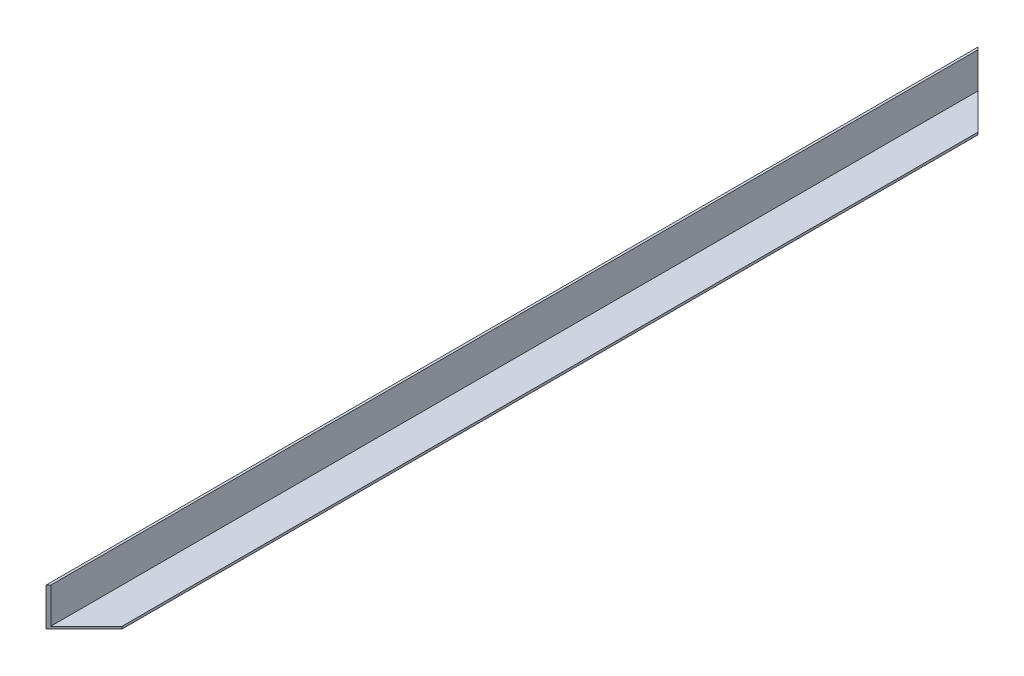
ISO-10303-21;
HEADER;
FILE_DESCRIPTION(('STEP AP214'),'2;1');
FILE_NAME('part.step','',(''),(''),'','','');
FILE_SCHEMA(('AUTOMOTIVE_DESIGN { 1 0 10303 214 1 1 1 1 }'));
ENDSEC;
DATA;
#1=APPLICATION_CONTEXT('core data for automotive mechanical design processes');
#2=APPLICATION_PROTOCOL_DEFINITION('international standard','automotive_design',2000,#1);
#3=PRODUCT_CONTEXT('',#1,'mechanical');
#4=PRODUCT('Part','Part','',(#3));
#5=PRODUCT_RELATED_PRODUCT_CATEGORY('part','',(#4));
#6=PRODUCT_DEFINITION_FORMATION('','',#4);
#7=PRODUCT_DEFINITION_CONTEXT('part definition',#1,'design');
#8=PRODUCT_DEFINITION('design','',#6,#7);
#9=PRODUCT_DEFINITION_SHAPE('','',#8);
#10=(LENGTH_UNIT() NAMED_UNIT(*) SI_UNIT(.MILLI.,.METRE.));
#11=(NAMED_UNIT(*) PLANE_ANGLE_UNIT() SI_UNIT($,.RADIAN.));
#12=(NAMED_UNIT(*) SI_UNIT($,.STERADIAN.) SOLID_ANGLE_UNIT());
#13=UNCERTAINTY_MEASURE_WITH_UNIT(LENGTH_MEASURE(1.E-05),#10,'distance_accuracy_value','');
#14=(GEOMETRIC_REPRESENTATION_CONTEXT(3) GLOBAL_UNCERTAINTY_ASSIGNED_CONTEXT((#13)) GLOBAL_UNIT_ASSIGNED_CONTEXT((#10,
#11,#12)) REPRESENTATION_CONTEXT('',''));
#15=CARTESIAN_POINT('',(0.,0.,0.));
#16=DIRECTION('',(0.,0.,1.));
#17=DIRECTION('',(1.,0.,0.));
#18=AXIS2_PLACEMENT_3D('',#15,#16,#17);
#19=CARTESIAN_POINT('',(0.,-1.,392.));
#20=DIRECTION('',(0.,1.,0.));
#21=DIRECTION('',(0.,0.,1.));
#22=AXIS2_PLACEMENT_3D('',#19,#20,#21);
#23=PLANE('',#22);
#24=DIRECTION('',(0.,0.,-1.));
#25=VECTOR('',#24,1.);
#26=CARTESIAN_POINT('',(-1.,-1.,392.));
#27=LINE('',#26,#25);
#28=CARTESIAN_POINT('',(-1.,-1.,392.));
#29=VERTEX_POINT('',#28);
#30=CARTESIAN_POINT('',(-1.,-1.,0.));
#31=VERTEX_POINT('',#30);
#32=EDGE_CURVE('E104',#29,#31,#27,.T.);
#33=ORIENTED_EDGE('',*,*,#32,.T.);
#34=DIRECTION('',(-0.707106781186547,0.,-0.707106781186548));
#35=VECTOR('',#34,1.);
#36=CARTESIAN_POINT('',(-1.,-1.,0.));
#37=LINE('',#36,#35);
#38=CARTESIAN_POINT('',(15.,-1.,16.));
#39=VERTEX_POINT('',#38);
#40=EDGE_CURVE('E86',#39,#31,#37,.T.);
#41=ORIENTED_EDGE('',*,*,#40,.F.);
#42=DIRECTION('',(0.,0.,-1.));
#43=VECTOR('',#42,1.);
#44=CARTESIAN_POINT('',(15.,-1.,392.));
#45=LINE('',#44,#43);
#46=CARTESIAN_POINT('',(15.,-1.,376.));
#47=VERTEX_POINT('',#46);
#48=EDGE_CURVE('E11',#47,#39,#45,.T.);
#49=ORIENTED_EDGE('',*,*,#48,.F.);
#50=DIRECTION('',(0.707106781186547,0.,-0.707106781186548));
#51=VECTOR('',#50,1.);
#52=CARTESIAN_POINT('',(-1.,-1.,392.));
#53=LINE('',#52,#51);
#54=EDGE_CURVE('E131',#29,#47,#53,.T.);
#55=ORIENTED_EDGE('',*,*,#54,.F.);
#56=EDGE_LOOP('',(#33,#41,#49,#55));
#57=FACE_BOUND('',#56,.T.);
#58=ADVANCED_FACE('F33',(#57),#23,.F.);
#59=CARTESIAN_POINT('',(15.,0.,392.));
#60=DIRECTION('',(1.,0.,0.));
#61=DIRECTION('',(0.,0.,-1.));
#62=AXIS2_PLACEMENT_3D('',#59,#60,#61);
#63=PLANE('',#62);
#64=DIRECTION('',(0.,-1.,0.));
#65=VECTOR('',#64,1.);
#66=CARTESIAN_POINT('',(15.,15.,16.));
#67=LINE('',#66,#65);
#68=CARTESIAN_POINT('',(15.,0.,16.));
#69=VERTEX_POINT('',#68);
#70=EDGE_CURVE('E101',#69,#39,#67,.T.);
#71=ORIENTED_EDGE('',*,*,#70,.F.);
#72=DIRECTION('',(0.,0.,-1.));
#73=VECTOR('',#72,1.);
#74=CARTESIAN_POINT('',(15.,0.,392.));
#75=LINE('',#74,#73);
#76=CARTESIAN_POINT('',(15.,0.,376.));
#77=VERTEX_POINT('',#76);
#78=EDGE_CURVE('E41',#77,#69,#75,.T.);
#79=ORIENTED_EDGE('',*,*,#78,.F.);
#80=DIRECTION('',(0.,-1.,0.));
#81=VECTOR('',#80,1.);
#82=CARTESIAN_POINT('',(15.,15.,376.));
#83=LINE('',#82,#81);
#84=EDGE_CURVE('E123',#77,#47,#83,.T.);
#85=ORIENTED_EDGE('',*,*,#84,.T.);
#86=ORIENTED_EDGE('',*,*,#48,.T.);
#87=EDGE_LOOP('',(#71,#79,#85,#86));
#88=FACE_BOUND('',#87,.T.);
#89=ADVANCED_FACE('F122',(#88),#63,.T.);
#90=CARTESIAN_POINT('',(0.,0.,392.));
#91=DIRECTION('',(0.,1.,0.));
#92=DIRECTION('',(0.,0.,1.));
#93=AXIS2_PLACEMENT_3D('',#90,#91,#92);
#94=PLANE('',#93);
#95=DIRECTION('',(0.707106781186547,0.,0.707106781186548));
#96=VECTOR('',#95,1.);
#97=CARTESIAN_POINT('',(195.5,0.,196.5));
#98=LINE('',#97,#96);
#99=CARTESIAN_POINT('',(0.,0.,1.));
#100=VERTEX_POINT('',#99);
#101=EDGE_CURVE('E118',#100,#69,#98,.T.);
#102=ORIENTED_EDGE('',*,*,#101,.F.);
#103=DIRECTION('',(0.,0.,-1.));
#104=VECTOR('',#103,1.);
#105=CARTESIAN_POINT('',(0.,0.,392.));
#106=LINE('',#105,#104);
#107=CARTESIAN_POINT('',(0.,0.,391.));
#108=VERTEX_POINT('',#107);
#109=EDGE_CURVE('E106',#108,#100,#106,.T.);
#110=ORIENTED_EDGE('',*,*,#109,.F.);
#111=DIRECTION('',(-0.707106781186547,0.,0.707106781186548));
#112=VECTOR('',#111,1.);
#113=CARTESIAN_POINT('',(-0.5,0.,391.5));
#114=LINE('',#113,#112);
#115=EDGE_CURVE('E92',#77,#108,#114,.T.);
#116=ORIENTED_EDGE('',*,*,#115,.F.);
#117=ORIENTED_EDGE('',*,*,#78,.T.);
#118=EDGE_LOOP('',(#102,#110,#116,#117));
#119=FACE_BOUND('',#118,.T.);
#120=ADVANCED_FACE('F116',(#119),#94,.T.);
#121=CARTESIAN_POINT('',(0.,0.,392.));
#122=DIRECTION('',(1.,0.,0.));
#123=DIRECTION('',(0.,0.,-1.));
#124=AXIS2_PLACEMENT_3D('',#121,#122,#123);
#125=PLANE('',#124);
#126=DIRECTION('',(0.,-1.,0.));
#127=VECTOR('',#126,1.);
#128=CARTESIAN_POINT('',(0.,0.,1.));
#129=LINE('',#128,#127);
#130=CARTESIAN_POINT('',(0.,15.,0.999999999999959));
#131=VERTEX_POINT('',#130);
#132=EDGE_CURVE('E125',#131,#100,#129,.T.);
#133=ORIENTED_EDGE('',*,*,#132,.F.);
#134=DIRECTION('',(0.,0.,-1.));
#135=VECTOR('',#134,1.);
#136=CARTESIAN_POINT('',(0.,15.,392.));
#137=LINE('',#136,#135);
#138=CARTESIAN_POINT('',(0.,15.,391.));
#139=VERTEX_POINT('',#138);
#140=EDGE_CURVE('E100',#139,#131,#137,.T.);
#141=ORIENTED_EDGE('',*,*,#140,.F.);
#142=DIRECTION('',(0.,1.,0.));
#143=VECTOR('',#142,1.);
#144=CARTESIAN_POINT('',(0.,0.,391.));
#145=LINE('',#144,#143);
#146=EDGE_CURVE('E135',#108,#139,#145,.T.);
#147=ORIENTED_EDGE('',*,*,#146,.F.);
#148=ORIENTED_EDGE('',*,*,#109,.T.);
#149=EDGE_LOOP('',(#133,#141,#147,#148));
#150=FACE_BOUND('',#149,.T.);
#151=ADVANCED_FACE('F148',(#150),#125,.T.);
#152=CARTESIAN_POINT('',(-1.,15.,392.));
#153=DIRECTION('',(0.,1.,0.));
#154=DIRECTION('',(0.,0.,1.));
#155=AXIS2_PLACEMENT_3D('',#152,#153,#154);
#156=PLANE('',#155);
#157=DIRECTION('',(-0.707106781186547,0.,-0.707106781186548));
#158=VECTOR('',#157,1.);
#159=CARTESIAN_POINT('',(-1.,15.,0.));
#160=LINE('',#159,#158);
#161=CARTESIAN_POINT('',(-1.,15.,0.));
#162=VERTEX_POINT('',#161);
#163=EDGE_CURVE('E83',#131,#162,#160,.T.);
#164=ORIENTED_EDGE('',*,*,#163,.T.);
#165=DIRECTION('',(0.,0.,-1.));
#166=VECTOR('',#165,1.);
#167=CARTESIAN_POINT('',(-1.,15.,392.));
#168=LINE('',#167,#166);
#169=CARTESIAN_POINT('',(-1.,15.,392.));
#170=VERTEX_POINT('',#169);
#171=EDGE_CURVE('E97',#170,#162,#168,.T.);
#172=ORIENTED_EDGE('',*,*,#171,.F.);
#173=DIRECTION('',(0.707106781186547,0.,-0.707106781186548));
#174=VECTOR('',#173,1.);
#175=CARTESIAN_POINT('',(-1.,15.,392.));
#176=LINE('',#175,#174);
#177=EDGE_CURVE('E47',#170,#139,#176,.T.);
#178=ORIENTED_EDGE('',*,*,#177,.T.);
#179=ORIENTED_EDGE('',*,*,#140,.T.);
#180=EDGE_LOOP('',(#164,#172,#178,#179));
#181=FACE_BOUND('',#180,.T.);
#182=ADVANCED_FACE('F96',(#181),#156,.T.);
#183=CARTESIAN_POINT('',(-1.,0.,392.));
#184=DIRECTION('',(1.,0.,0.));
#185=DIRECTION('',(0.,0.,-1.));
#186=AXIS2_PLACEMENT_3D('',#183,#184,#185);
#187=PLANE('',#186);
#188=DIRECTION('',(0.,1.,0.));
#189=VECTOR('',#188,1.);
#190=CARTESIAN_POINT('',(-1.,0.,0.));
#191=LINE('',#190,#189);
#192=EDGE_CURVE('E80',#162,#31,#191,.F.);
#193=ORIENTED_EDGE('',*,*,#192,.T.);
#194=ORIENTED_EDGE('',*,*,#32,.F.);
#195=DIRECTION('',(0.,1.,0.));
#196=VECTOR('',#195,1.);
#197=CARTESIAN_POINT('',(-1.,0.,392.));
#198=LINE('',#197,#196);
#199=EDGE_CURVE('E91',#170,#29,#198,.F.);
#200=ORIENTED_EDGE('',*,*,#199,.F.);
#201=ORIENTED_EDGE('',*,*,#171,.T.);
#202=EDGE_LOOP('',(#193,#194,#200,#201));
#203=FACE_BOUND('',#202,.T.);
#204=ADVANCED_FACE('F103',(#203),#187,.F.);
#205=CARTESIAN_POINT('',(-1.,15.,392.));
#206=DIRECTION('',(-0.707106781186548,0.,-0.707106781186547));
#207=DIRECTION('',(-0.707106781186547,0.,0.707106781186548));
#208=AXIS2_PLACEMENT_3D('',#205,#206,#207);
#209=PLANE('',#208);
#210=ORIENTED_EDGE('',*,*,#115,.T.);
#211=ORIENTED_EDGE('',*,*,#146,.T.);
#212=ORIENTED_EDGE('',*,*,#177,.F.);
#213=ORIENTED_EDGE('',*,*,#199,.T.);
#214=ORIENTED_EDGE('',*,*,#54,.T.);
#215=ORIENTED_EDGE('',*,*,#84,.F.);
#216=EDGE_LOOP('',(#210,#211,#212,#213,#214,#215));
#217=FACE_BOUND('',#216,.T.);
#218=ADVANCED_FACE('F139',(#217),#209,.F.);
#219=CARTESIAN_POINT('',(-1.,15.,0.));
#220=DIRECTION('',(-0.707106781186548,0.,0.707106781186547));
#221=DIRECTION('',(0.707106781186547,0.,0.707106781186548));
#222=AXIS2_PLACEMENT_3D('',#219,#220,#221);
#223=PLANE('',#222);
#224=ORIENTED_EDGE('',*,*,#101,.T.);
#225=ORIENTED_EDGE('',*,*,#70,.T.);
#226=ORIENTED_EDGE('',*,*,#40,.T.);
#227=ORIENTED_EDGE('',*,*,#192,.F.);
#228=ORIENTED_EDGE('',*,*,#163,.F.);
#229=ORIENTED_EDGE('',*,*,#132,.T.);
#230=EDGE_LOOP('',(#224,#225,#226,#227,#228,#229));
#231=FACE_BOUND('',#230,.T.);
#232=ADVANCED_FACE('F82',(#231),#223,.F.);
#233=CLOSED_SHELL('',(#58,#89,#120,#151,#182,#204,#218,#232));
#234=MANIFOLD_SOLID_BREP('B2',#233);
#235=ADVANCED_BREP_SHAPE_REPRESENTATION('',(#18,#234),#14);
#236=SHAPE_DEFINITION_REPRESENTATION(#9,#235);
ENDSEC;
END-ISO-10303-21;
